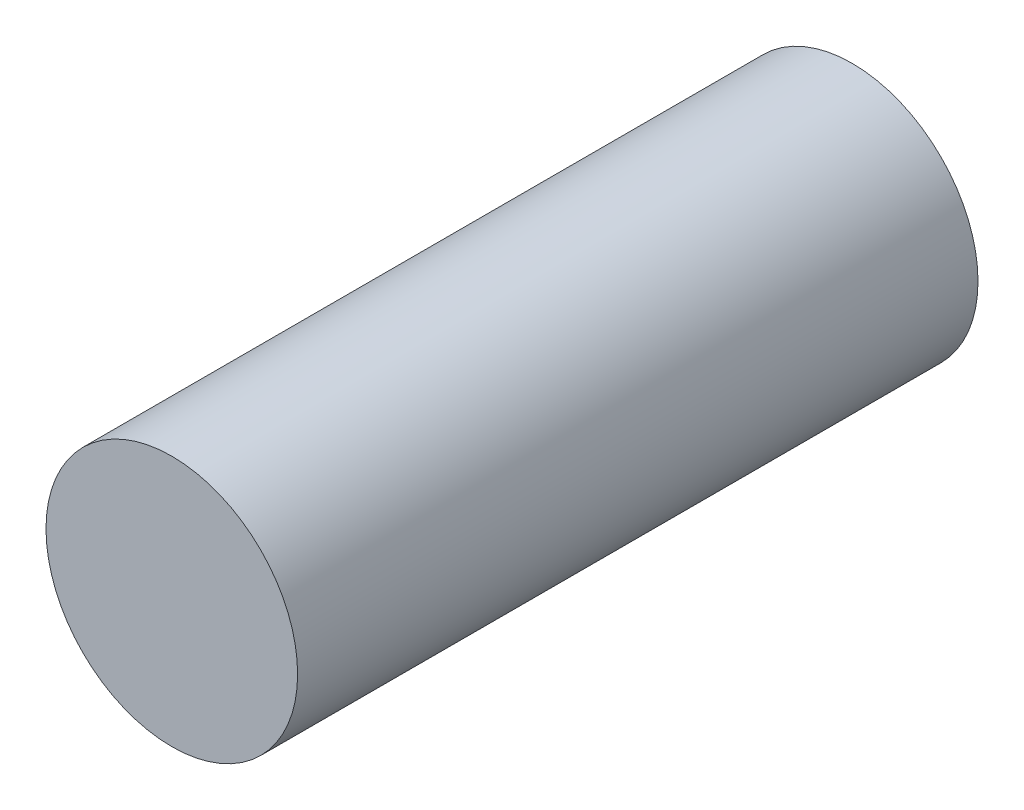
ISO-10303-21;
HEADER;
FILE_DESCRIPTION(('STEP AP214'),'2;1');
FILE_NAME('part.step','',(''),(''),'','','');
FILE_SCHEMA(('AUTOMOTIVE_DESIGN { 1 0 10303 214 1 1 1 1 }'));
ENDSEC;
DATA;
#1=APPLICATION_CONTEXT('core data for automotive mechanical design processes');
#2=APPLICATION_PROTOCOL_DEFINITION('international standard','automotive_design',2000,#1);
#3=PRODUCT_CONTEXT('',#1,'mechanical');
#4=PRODUCT('Part','Part','',(#3));
#5=PRODUCT_RELATED_PRODUCT_CATEGORY('part','',(#4));
#6=PRODUCT_DEFINITION_FORMATION('','',#4);
#7=PRODUCT_DEFINITION_CONTEXT('part definition',#1,'design');
#8=PRODUCT_DEFINITION('design','',#6,#7);
#9=PRODUCT_DEFINITION_SHAPE('','',#8);
#10=(LENGTH_UNIT() NAMED_UNIT(*) SI_UNIT(.MILLI.,.METRE.));
#11=(NAMED_UNIT(*) PLANE_ANGLE_UNIT() SI_UNIT($,.RADIAN.));
#12=(NAMED_UNIT(*) SI_UNIT($,.STERADIAN.) SOLID_ANGLE_UNIT());
#13=UNCERTAINTY_MEASURE_WITH_UNIT(LENGTH_MEASURE(1.E-05),#10,'distance_accuracy_value','');
#14=(GEOMETRIC_REPRESENTATION_CONTEXT(3) GLOBAL_UNCERTAINTY_ASSIGNED_CONTEXT((#13)) GLOBAL_UNIT_ASSIGNED_CONTEXT((#10,
#11,#12)) REPRESENTATION_CONTEXT('',''));
#15=CARTESIAN_POINT('',(0.,0.,0.));
#16=DIRECTION('',(0.,0.,1.));
#17=DIRECTION('',(1.,0.,0.));
#18=AXIS2_PLACEMENT_3D('',#15,#16,#17);
#19=CARTESIAN_POINT('',(0.,0.,6.731));
#20=DIRECTION('',(0.,0.,-1.));
#21=DIRECTION('',(-1.,0.,0.));
#22=AXIS2_PLACEMENT_3D('',#19,#20,#21);
#23=CYLINDRICAL_SURFACE('',#22,1.2446);
#24=CARTESIAN_POINT('',(0.,0.,6.731));
#25=DIRECTION('',(0.,0.,1.));
#26=DIRECTION('',(1.,0.,0.));
#27=AXIS2_PLACEMENT_3D('',#24,#25,#26);
#28=CIRCLE('',#27,1.2446);
#29=CARTESIAN_POINT('',(1.2446,0.,6.731));
#30=VERTEX_POINT('',#29);
#31=EDGE_CURVE('E10',#30,#30,#28,.T.);
#32=ORIENTED_EDGE('',*,*,#31,.F.);
#33=EDGE_LOOP('',(#32));
#34=FACE_BOUND('',#33,.T.);
#35=CARTESIAN_POINT('',(0.,0.,0.));
#36=DIRECTION('',(0.,0.,1.));
#37=DIRECTION('',(1.,0.,0.));
#38=AXIS2_PLACEMENT_3D('',#35,#36,#37);
#39=CIRCLE('',#38,1.2446);
#40=CARTESIAN_POINT('',(1.2446,0.,0.));
#41=VERTEX_POINT('',#40);
#42=EDGE_CURVE('E44',#41,#41,#39,.T.);
#43=ORIENTED_EDGE('',*,*,#42,.T.);
#44=EDGE_LOOP('',(#43));
#45=FACE_BOUND('',#44,.T.);
#46=ADVANCED_FACE('F41',(#34,#45),#23,.T.);
#47=CARTESIAN_POINT('',(0.,0.,6.731));
#48=DIRECTION('',(0.,0.,1.));
#49=DIRECTION('',(1.,0.,0.));
#50=AXIS2_PLACEMENT_3D('',#47,#48,#49);
#51=PLANE('',#50);
#52=ORIENTED_EDGE('',*,*,#31,.T.);
#53=EDGE_LOOP('',(#52));
#54=FACE_BOUND('',#53,.T.);
#55=ADVANCED_FACE('F56',(#54),#51,.T.);
#56=CARTESIAN_POINT('',(0.,0.,0.));
#57=DIRECTION('',(0.,0.,1.));
#58=DIRECTION('',(1.,0.,0.));
#59=AXIS2_PLACEMENT_3D('',#56,#57,#58);
#60=PLANE('',#59);
#61=ORIENTED_EDGE('',*,*,#42,.F.);
#62=EDGE_LOOP('',(#61));
#63=FACE_BOUND('',#62,.T.);
#64=ADVANCED_FACE('F54',(#63),#60,.F.);
#65=CLOSED_SHELL('',(#46,#55,#64));
#66=MANIFOLD_SOLID_BREP('B2',#65);
#67=ADVANCED_BREP_SHAPE_REPRESENTATION('',(#18,#66),#14);
#68=SHAPE_DEFINITION_REPRESENTATION(#9,#67);
ENDSEC;
END-ISO-10303-21;
